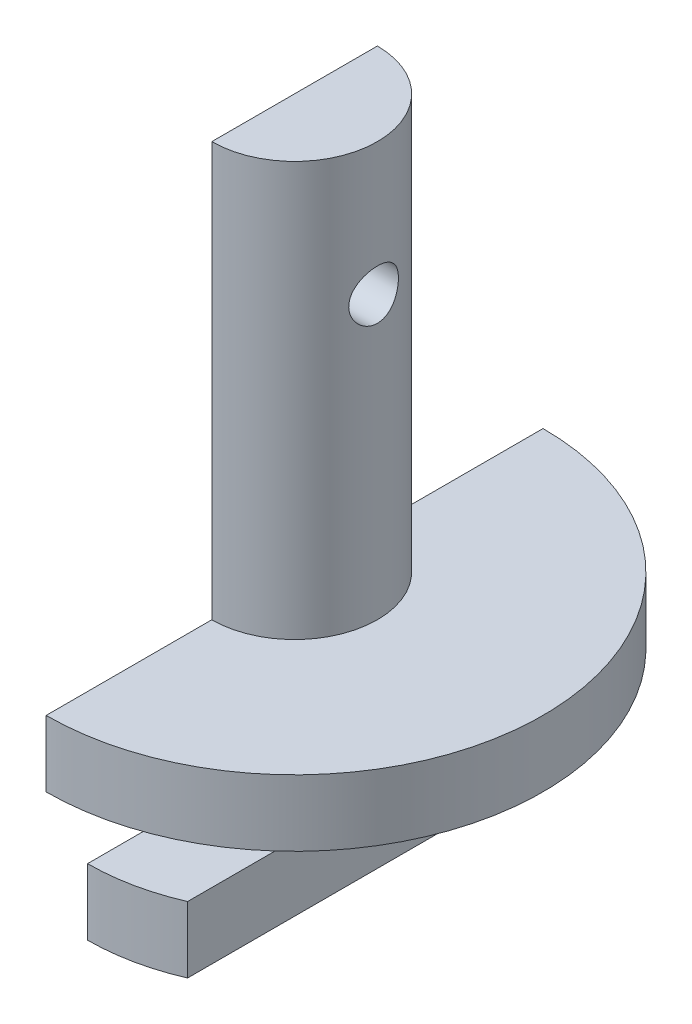
ISO-10303-21;
HEADER;
FILE_DESCRIPTION(('STEP AP214'),'2;1');
FILE_NAME('part.step','',(''),(''),'','','');
FILE_SCHEMA(('AUTOMOTIVE_DESIGN { 1 0 10303 214 1 1 1 1 }'));
ENDSEC;
DATA;
#1=APPLICATION_CONTEXT('core data for automotive mechanical design processes');
#2=APPLICATION_PROTOCOL_DEFINITION('international standard','automotive_design',2000,#1);
#3=PRODUCT_CONTEXT('',#1,'mechanical');
#4=PRODUCT('Part','Part','',(#3));
#5=PRODUCT_RELATED_PRODUCT_CATEGORY('part','',(#4));
#6=PRODUCT_DEFINITION_FORMATION('','',#4);
#7=PRODUCT_DEFINITION_CONTEXT('part definition',#1,'design');
#8=PRODUCT_DEFINITION('design','',#6,#7);
#9=PRODUCT_DEFINITION_SHAPE('','',#8);
#10=(LENGTH_UNIT() NAMED_UNIT(*) SI_UNIT(.MILLI.,.METRE.));
#11=(NAMED_UNIT(*) PLANE_ANGLE_UNIT() SI_UNIT($,.RADIAN.));
#12=(NAMED_UNIT(*) SI_UNIT($,.STERADIAN.) SOLID_ANGLE_UNIT());
#13=UNCERTAINTY_MEASURE_WITH_UNIT(LENGTH_MEASURE(1.E-05),#10,'distance_accuracy_value','');
#14=(GEOMETRIC_REPRESENTATION_CONTEXT(3) GLOBAL_UNCERTAINTY_ASSIGNED_CONTEXT((#13)) GLOBAL_UNIT_ASSIGNED_CONTEXT((#10,
#11,#12)) REPRESENTATION_CONTEXT('',''));
#15=CARTESIAN_POINT('',(0.,0.,0.));
#16=DIRECTION('',(0.,0.,1.));
#17=DIRECTION('',(1.,0.,0.));
#18=AXIS2_PLACEMENT_3D('',#15,#16,#17);
#19=CARTESIAN_POINT('',(0.,0.,0.));
#20=DIRECTION('',(0.,-1.,0.));
#21=DIRECTION('',(0.,0.,-1.));
#22=AXIS2_PLACEMENT_3D('',#19,#20,#21);
#23=CYLINDRICAL_SURFACE('',#22,12.5);
#24=DIRECTION('',(0.,-1.,0.));
#25=VECTOR('',#24,1.);
#26=CARTESIAN_POINT('',(0.,0.,12.5));
#27=LINE('',#26,#25);
#28=CARTESIAN_POINT('',(0.,0.,12.5));
#29=VERTEX_POINT('',#28);
#30=CARTESIAN_POINT('',(0.,4.,12.5));
#31=VERTEX_POINT('',#30);
#32=EDGE_CURVE('E240',#29,#31,#27,.F.);
#33=ORIENTED_EDGE('',*,*,#32,.F.);
#34=CARTESIAN_POINT('',(0.,0.,0.));
#35=DIRECTION('',(0.,-1.,0.));
#36=DIRECTION('',(0.,0.,-1.));
#37=AXIS2_PLACEMENT_3D('',#34,#35,#36);
#38=CIRCLE('',#37,12.5);
#39=CARTESIAN_POINT('',(5.,0.,11.4564392373896));
#40=VERTEX_POINT('',#39);
#41=EDGE_CURVE('E11',#40,#29,#38,.T.);
#42=ORIENTED_EDGE('',*,*,#41,.F.);
#43=DIRECTION('',(0.,-1.,0.));
#44=VECTOR('',#43,1.);
#45=CARTESIAN_POINT('',(5.,0.,11.4564392373896));
#46=LINE('',#45,#44);
#47=CARTESIAN_POINT('',(5.,4.,11.4564392373896));
#48=VERTEX_POINT('',#47);
#49=EDGE_CURVE('E224',#48,#40,#46,.T.);
#50=ORIENTED_EDGE('',*,*,#49,.F.);
#51=CARTESIAN_POINT('',(0.,4.,0.));
#52=DIRECTION('',(0.,-1.,0.));
#53=DIRECTION('',(0.,0.,-1.));
#54=AXIS2_PLACEMENT_3D('',#51,#52,#53);
#55=CIRCLE('',#54,12.5);
#56=EDGE_CURVE('E156',#48,#31,#55,.T.);
#57=ORIENTED_EDGE('',*,*,#56,.T.);
#58=EDGE_LOOP('',(#33,#42,#50,#57));
#59=FACE_BOUND('',#58,.T.);
#60=ADVANCED_FACE('F33',(#59),#23,.T.);
#61=CARTESIAN_POINT('',(12.5,4.,0.));
#62=DIRECTION('',(0.,1.,0.));
#63=DIRECTION('',(0.,0.,1.));
#64=AXIS2_PLACEMENT_3D('',#61,#62,#63);
#65=PLANE('',#64);
#66=DIRECTION('',(0.,0.,-1.));
#67=VECTOR('',#66,1.);
#68=CARTESIAN_POINT('',(0.,4.,0.));
#69=LINE('',#68,#67);
#70=CARTESIAN_POINT('',(0.,4.,7.5));
#71=VERTEX_POINT('',#70);
#72=EDGE_CURVE('E239',#31,#71,#69,.T.);
#73=ORIENTED_EDGE('',*,*,#72,.F.);
#74=ORIENTED_EDGE('',*,*,#56,.F.);
#75=DIRECTION('',(0.,0.,1.));
#76=VECTOR('',#75,1.);
#77=CARTESIAN_POINT('',(5.,4.,-15.));
#78=LINE('',#77,#76);
#79=CARTESIAN_POINT('',(5.,4.,5.59016994374948));
#80=VERTEX_POINT('',#79);
#81=EDGE_CURVE('E164',#80,#48,#78,.T.);
#82=ORIENTED_EDGE('',*,*,#81,.F.);
#83=CARTESIAN_POINT('',(0.,4.,0.));
#84=DIRECTION('',(0.,-1.,0.));
#85=DIRECTION('',(0.,0.,-1.));
#86=AXIS2_PLACEMENT_3D('',#83,#84,#85);
#87=CIRCLE('',#86,7.5);
#88=EDGE_CURVE('E155',#80,#71,#87,.T.);
#89=ORIENTED_EDGE('',*,*,#88,.T.);
#90=EDGE_LOOP('',(#73,#74,#82,#89));
#91=FACE_BOUND('',#90,.T.);
#92=ADVANCED_FACE('F192',(#91),#65,.T.);
#93=CARTESIAN_POINT('',(0.,0.,0.));
#94=DIRECTION('',(0.,-1.,0.));
#95=DIRECTION('',(0.,0.,-1.));
#96=AXIS2_PLACEMENT_3D('',#93,#94,#95);
#97=CYLINDRICAL_SURFACE('',#96,15.);
#98=CARTESIAN_POINT('',(0.,9.,0.));
#99=DIRECTION('',(0.,-1.,0.));
#100=DIRECTION('',(0.,0.,-1.));
#101=AXIS2_PLACEMENT_3D('',#98,#99,#100);
#102=CIRCLE('',#101,15.);
#103=CARTESIAN_POINT('',(0.,9.,-15.));
#104=VERTEX_POINT('',#103);
#105=CARTESIAN_POINT('',(0.,9.,15.));
#106=VERTEX_POINT('',#105);
#107=EDGE_CURVE('E138',#104,#106,#102,.T.);
#108=ORIENTED_EDGE('',*,*,#107,.F.);
#109=DIRECTION('',(0.,1.,0.));
#110=VECTOR('',#109,1.);
#111=CARTESIAN_POINT('',(0.,-5.62511796928788,-15.));
#112=LINE('',#111,#110);
#113=CARTESIAN_POINT('',(0.,13.,-15.));
#114=VERTEX_POINT('',#113);
#115=EDGE_CURVE('E141',#104,#114,#112,.T.);
#116=ORIENTED_EDGE('',*,*,#115,.T.);
#117=CARTESIAN_POINT('',(0.,13.,0.));
#118=DIRECTION('',(0.,-1.,0.));
#119=DIRECTION('',(0.,0.,-1.));
#120=AXIS2_PLACEMENT_3D('',#117,#118,#119);
#121=CIRCLE('',#120,15.);
#122=CARTESIAN_POINT('',(0.,13.,15.));
#123=VERTEX_POINT('',#122);
#124=EDGE_CURVE('E140',#114,#123,#121,.T.);
#125=ORIENTED_EDGE('',*,*,#124,.T.);
#126=DIRECTION('',(0.,1.,0.));
#127=VECTOR('',#126,1.);
#128=CARTESIAN_POINT('',(0.,-5.62511796928788,15.));
#129=LINE('',#128,#127);
#130=EDGE_CURVE('E122',#106,#123,#129,.T.);
#131=ORIENTED_EDGE('',*,*,#130,.F.);
#132=EDGE_LOOP('',(#108,#116,#125,#131));
#133=FACE_BOUND('',#132,.T.);
#134=ADVANCED_FACE('F136',(#133),#97,.T.);
#135=CARTESIAN_POINT('',(0.,0.,0.));
#136=DIRECTION('',(0.,-1.,0.));
#137=DIRECTION('',(0.,0.,-1.));
#138=AXIS2_PLACEMENT_3D('',#135,#136,#137);
#139=PLANE('',#138);
#140=DIRECTION('',(0.,0.,1.));
#141=VECTOR('',#140,1.);
#142=CARTESIAN_POINT('',(0.,0.,0.));
#143=LINE('',#142,#141);
#144=CARTESIAN_POINT('',(0.,0.,-12.5));
#145=VERTEX_POINT('',#144);
#146=EDGE_CURVE('E219',#145,#29,#143,.T.);
#147=ORIENTED_EDGE('',*,*,#146,.F.);
#148=CARTESIAN_POINT('',(5.,0.,-11.4564392373896));
#149=VERTEX_POINT('',#148);
#150=EDGE_CURVE('E42',#145,#149,#38,.T.);
#151=ORIENTED_EDGE('',*,*,#150,.T.);
#152=DIRECTION('',(0.,0.,-1.));
#153=VECTOR('',#152,1.);
#154=CARTESIAN_POINT('',(5.,0.,0.));
#155=LINE('',#154,#153);
#156=EDGE_CURVE('E227',#40,#149,#155,.T.);
#157=ORIENTED_EDGE('',*,*,#156,.F.);
#158=ORIENTED_EDGE('',*,*,#41,.T.);
#159=EDGE_LOOP('',(#147,#151,#157,#158));
#160=FACE_BOUND('',#159,.T.);
#161=ADVANCED_FACE('F35',(#160),#139,.T.);
#162=DIRECTION('',(0.,-1.,0.));
#163=VECTOR('',#162,1.);
#164=CARTESIAN_POINT('',(0.,0.,-12.5));
#165=LINE('',#164,#163);
#166=CARTESIAN_POINT('',(0.,4.,-12.5));
#167=VERTEX_POINT('',#166);
#168=EDGE_CURVE('E213',#167,#145,#165,.T.);
#169=ORIENTED_EDGE('',*,*,#168,.F.);
#170=CARTESIAN_POINT('',(5.,4.,-11.4564392373896));
#171=VERTEX_POINT('',#170);
#172=EDGE_CURVE('E154',#167,#171,#55,.T.);
#173=ORIENTED_EDGE('',*,*,#172,.T.);
#174=DIRECTION('',(0.,-1.,0.));
#175=VECTOR('',#174,1.);
#176=CARTESIAN_POINT('',(5.,0.,-11.4564392373896));
#177=LINE('',#176,#175);
#178=EDGE_CURVE('E247',#149,#171,#177,.F.);
#179=ORIENTED_EDGE('',*,*,#178,.F.);
#180=ORIENTED_EDGE('',*,*,#150,.F.);
#181=EDGE_LOOP('',(#169,#173,#179,#180));
#182=FACE_BOUND('',#181,.T.);
#183=ADVANCED_FACE('F194',(#182),#23,.T.);
#184=CARTESIAN_POINT('',(0.,4.,-7.5));
#185=VERTEX_POINT('',#184);
#186=EDGE_CURVE('E218',#185,#167,#69,.T.);
#187=ORIENTED_EDGE('',*,*,#186,.F.);
#188=CARTESIAN_POINT('',(5.,4.,-5.59016994374948));
#189=VERTEX_POINT('',#188);
#190=EDGE_CURVE('E58',#185,#189,#87,.T.);
#191=ORIENTED_EDGE('',*,*,#190,.T.);
#192=EDGE_CURVE('E221',#171,#189,#78,.T.);
#193=ORIENTED_EDGE('',*,*,#192,.F.);
#194=ORIENTED_EDGE('',*,*,#172,.F.);
#195=EDGE_LOOP('',(#187,#191,#193,#194));
#196=FACE_BOUND('',#195,.T.);
#197=ADVANCED_FACE('F201',(#196),#65,.T.);
#198=CARTESIAN_POINT('',(0.,0.,0.));
#199=DIRECTION('',(0.,-1.,0.));
#200=DIRECTION('',(0.,0.,-1.));
#201=AXIS2_PLACEMENT_3D('',#198,#199,#200);
#202=CYLINDRICAL_SURFACE('',#201,7.5);
#203=DIRECTION('',(0.,-1.,0.));
#204=VECTOR('',#203,1.);
#205=CARTESIAN_POINT('',(0.,0.,7.5));
#206=LINE('',#205,#204);
#207=CARTESIAN_POINT('',(0.,9.,7.5));
#208=VERTEX_POINT('',#207);
#209=EDGE_CURVE('E125',#71,#208,#206,.F.);
#210=ORIENTED_EDGE('',*,*,#209,.F.);
#211=ORIENTED_EDGE('',*,*,#88,.F.);
#212=EDGE_CURVE('E152',#189,#80,#87,.T.);
#213=ORIENTED_EDGE('',*,*,#212,.F.);
#214=ORIENTED_EDGE('',*,*,#190,.F.);
#215=DIRECTION('',(0.,-1.,0.));
#216=VECTOR('',#215,1.);
#217=CARTESIAN_POINT('',(0.,0.,-7.5));
#218=LINE('',#217,#216);
#219=CARTESIAN_POINT('',(0.,9.,-7.5));
#220=VERTEX_POINT('',#219);
#221=EDGE_CURVE('E244',#220,#185,#218,.T.);
#222=ORIENTED_EDGE('',*,*,#221,.F.);
#223=CARTESIAN_POINT('',(0.,9.,0.));
#224=DIRECTION('',(0.,-1.,0.));
#225=DIRECTION('',(0.,0.,-1.));
#226=AXIS2_PLACEMENT_3D('',#223,#224,#225);
#227=CIRCLE('',#226,7.5);
#228=EDGE_CURVE('E145',#220,#208,#227,.T.);
#229=ORIENTED_EDGE('',*,*,#228,.T.);
#230=EDGE_LOOP('',(#210,#211,#213,#214,#222,#229));
#231=FACE_BOUND('',#230,.T.);
#232=ADVANCED_FACE('F209',(#231),#202,.T.);
#233=CARTESIAN_POINT('',(7.5,9.,0.));
#234=DIRECTION('',(0.,-1.,0.));
#235=DIRECTION('',(0.,0.,-1.));
#236=AXIS2_PLACEMENT_3D('',#233,#234,#235);
#237=PLANE('',#236);
#238=DIRECTION('',(0.,0.,1.));
#239=VECTOR('',#238,1.);
#240=CARTESIAN_POINT('',(0.,9.,0.));
#241=LINE('',#240,#239);
#242=EDGE_CURVE('E132',#104,#220,#241,.T.);
#243=ORIENTED_EDGE('',*,*,#242,.F.);
#244=ORIENTED_EDGE('',*,*,#107,.T.);
#245=EDGE_CURVE('E118',#208,#106,#241,.T.);
#246=ORIENTED_EDGE('',*,*,#245,.F.);
#247=ORIENTED_EDGE('',*,*,#228,.F.);
#248=EDGE_LOOP('',(#243,#244,#246,#247));
#249=FACE_BOUND('',#248,.T.);
#250=ADVANCED_FACE('F144',(#249),#237,.T.);
#251=CARTESIAN_POINT('',(15.,13.,0.));
#252=DIRECTION('',(0.,1.,0.));
#253=DIRECTION('',(0.,0.,1.));
#254=AXIS2_PLACEMENT_3D('',#251,#252,#253);
#255=PLANE('',#254);
#256=DIRECTION('',(0.,0.,-1.));
#257=VECTOR('',#256,1.);
#258=CARTESIAN_POINT('',(0.,13.,0.));
#259=LINE('',#258,#257);
#260=CARTESIAN_POINT('',(0.,13.,5.));
#261=VERTEX_POINT('',#260);
#262=EDGE_CURVE('E130',#123,#261,#259,.T.);
#263=ORIENTED_EDGE('',*,*,#262,.F.);
#264=ORIENTED_EDGE('',*,*,#124,.F.);
#265=CARTESIAN_POINT('',(0.,13.,-5.));
#266=VERTEX_POINT('',#265);
#267=EDGE_CURVE('E257',#266,#114,#259,.T.);
#268=ORIENTED_EDGE('',*,*,#267,.F.);
#269=CARTESIAN_POINT('',(0.,13.,0.));
#270=DIRECTION('',(0.,-1.,0.));
#271=DIRECTION('',(0.,0.,-1.));
#272=AXIS2_PLACEMENT_3D('',#269,#270,#271);
#273=CIRCLE('',#272,5.);
#274=EDGE_CURVE('E148',#266,#261,#273,.T.);
#275=ORIENTED_EDGE('',*,*,#274,.T.);
#276=EDGE_LOOP('',(#263,#264,#268,#275));
#277=FACE_BOUND('',#276,.T.);
#278=ADVANCED_FACE('F189',(#277),#255,.T.);
#279=CARTESIAN_POINT('',(0.,0.,0.));
#280=DIRECTION('',(0.,-1.,0.));
#281=DIRECTION('',(0.,0.,-1.));
#282=AXIS2_PLACEMENT_3D('',#279,#280,#281);
#283=CYLINDRICAL_SURFACE('',#282,5.);
#284=DIRECTION('',(0.,-1.,0.));
#285=VECTOR('',#284,1.);
#286=CARTESIAN_POINT('',(0.,0.,5.));
#287=LINE('',#286,#285);
#288=CARTESIAN_POINT('',(0.,38.,5.));
#289=VERTEX_POINT('',#288);
#290=EDGE_CURVE('E50',#261,#289,#287,.F.);
#291=ORIENTED_EDGE('',*,*,#290,.F.);
#292=ORIENTED_EDGE('',*,*,#274,.F.);
#293=DIRECTION('',(0.,-1.,0.));
#294=VECTOR('',#293,1.);
#295=CARTESIAN_POINT('',(0.,0.,-5.));
#296=LINE('',#295,#294);
#297=CARTESIAN_POINT('',(0.,38.,-5.));
#298=VERTEX_POINT('',#297);
#299=EDGE_CURVE('E260',#298,#266,#296,.T.);
#300=ORIENTED_EDGE('',*,*,#299,.F.);
#301=CARTESIAN_POINT('',(0.,38.,0.));
#302=DIRECTION('',(0.,-1.,0.));
#303=DIRECTION('',(0.,0.,-1.));
#304=AXIS2_PLACEMENT_3D('',#301,#302,#303);
#305=CIRCLE('',#304,5.);
#306=EDGE_CURVE('E249',#298,#289,#305,.T.);
#307=ORIENTED_EDGE('',*,*,#306,.T.);
#308=EDGE_LOOP('',(#291,#292,#300,#307));
#309=FACE_BOUND('',#308,.T.);
#310=CARTESIAN_POINT('',(4.76969600708473,30.,-1.5));
#311=CARTESIAN_POINT('',(4.7696968572698,30.0821945479424,-1.49999897633764));
#312=CARTESIAN_POINT('',(4.77184390209069,30.164399224144,-1.49322108167142));
#313=CARTESIAN_POINT('',(4.780165783029,30.3264052495919,-1.46635844446749));
#314=CARTESIAN_POINT('',(4.78634196493468,30.4062057865015,-1.44626925573578));
#315=CARTESIAN_POINT('',(4.80196102485633,30.5610347282717,-1.39352753269955));
#316=CARTESIAN_POINT('',(4.81139846703232,30.6360708296331,-1.36089589394244));
#317=CARTESIAN_POINT('',(4.83246932547567,30.7796219339953,-1.28406421917929));
#318=CARTESIAN_POINT('',(4.8441030704102,30.8481359586844,-1.23986245137053));
#319=CARTESIAN_POINT('',(4.86866862185766,30.9788663905774,-1.13964754141627));
#320=CARTESIAN_POINT('',(4.88162808311636,31.0408458979463,-1.08333207175807));
#321=CARTESIAN_POINT('',(4.90714861936757,31.1546379513225,-0.9611362375796));
#322=CARTESIAN_POINT('',(4.91970964297705,31.2064491904499,-0.895254645461113));
#323=CARTESIAN_POINT('',(4.94333214579389,31.2994626998333,-0.754111437793691));
#324=CARTESIAN_POINT('',(4.95435724342404,31.3404234244428,-0.678684021335815));
#325=CARTESIAN_POINT('',(4.97334435920684,31.4089872590428,-0.521624645369353));
#326=CARTESIAN_POINT('',(4.98130703789496,31.4365932498575,-0.43999402838791));
#327=CARTESIAN_POINT('',(4.9930764600359,31.4768800010905,-0.275323852630828));
#328=CARTESIAN_POINT('',(4.99699557369339,31.4899651276527,-0.1923913989538));
#329=CARTESIAN_POINT('',(5.00063201501348,31.5021173246464,-0.0254218237493145));
#330=CARTESIAN_POINT('',(5.00035022521079,31.501187339402,0.0586150620503683));
#331=CARTESIAN_POINT('',(4.99569603817659,31.485607131457,0.22257115660016));
#332=CARTESIAN_POINT('',(4.9914542020526,31.4713948061901,0.302536267641342));
#333=CARTESIAN_POINT('',(4.97951522112593,31.4303686640057,0.458889213442527));
#334=CARTESIAN_POINT('',(4.97181785750586,31.4035540490573,0.535276821322846));
#335=CARTESIAN_POINT('',(4.95365220986963,31.3377879765814,0.683347326351281));
#336=CARTESIAN_POINT('',(4.94315269676706,31.2986987971927,0.754965064694479));
#337=CARTESIAN_POINT('',(4.92049640648069,31.2096021475718,0.890764673783157));
#338=CARTESIAN_POINT('',(4.90833923637778,31.1595920870365,0.954944774872131));
#339=CARTESIAN_POINT('',(4.88311550488166,31.0478022492484,1.0766604815298));
#340=CARTESIAN_POINT('',(4.87003195321461,30.9856430809703,1.13384458040112));
#341=CARTESIAN_POINT('',(4.84483979887497,30.8524899821099,1.23707651539824));
#342=CARTESIAN_POINT('',(4.8327312931702,30.7814951746108,1.28312324482853));
#343=CARTESIAN_POINT('',(4.81077903197678,30.631760530751,1.3631399533545));
#344=CARTESIAN_POINT('',(4.80095810695957,30.5529529541371,1.39698989237679));
#345=CARTESIAN_POINT('',(4.78496392548436,30.3903927915545,1.45083362878413));
#346=CARTESIAN_POINT('',(4.7787894791583,30.3066418284654,1.4708319464056));
#347=CARTESIAN_POINT('',(4.77104849541241,30.1399176392607,1.49574770282165));
#348=CARTESIAN_POINT('',(4.76931878670441,30.057031776106,1.50119946380212));
#349=CARTESIAN_POINT('',(4.77021192441924,29.8915270999901,1.49835947233062));
#350=CARTESIAN_POINT('',(4.77283416156589,29.8089082512691,1.4900696437133));
#351=CARTESIAN_POINT('',(4.78197558554912,29.6485116220291,1.4604576357419));
#352=CARTESIAN_POINT('',(4.78839176507489,29.5706638357365,1.4394796143128));
#353=CARTESIAN_POINT('',(4.80429141231227,29.4195983091851,1.3854857774794));
#354=CARTESIAN_POINT('',(4.81377535359073,29.3463812858594,1.35246810342759));
#355=CARTESIAN_POINT('',(4.83505835023047,29.2044825359279,1.274318711965));
#356=CARTESIAN_POINT('',(4.84691271069799,29.1359752790142,1.22888564172729));
#357=CARTESIAN_POINT('',(4.87148205646987,29.0073618938192,1.12755301600385));
#358=CARTESIAN_POINT('',(4.88419724730003,28.9472577823872,1.07165095534897));
#359=CARTESIAN_POINT('',(4.90963633548158,28.8348195941853,0.948455132493598));
#360=CARTESIAN_POINT('',(4.92234245063004,28.782864371013,0.880811065857434));
#361=CARTESIAN_POINT('',(4.94584851748651,28.6910332989722,0.737461784590248));
#362=CARTESIAN_POINT('',(4.95664856384717,28.6511568502185,0.661756970543942));
#363=CARTESIAN_POINT('',(4.97505970474957,28.5849999694317,0.504935504705219));
#364=CARTESIAN_POINT('',(4.98269453424966,28.558617983841,0.423864622037837));
#365=CARTESIAN_POINT('',(4.99401979596827,28.5199390811096,0.258169966504587));
#366=CARTESIAN_POINT('',(4.9977113567088,28.5076381340516,0.173547217354761));
#367=CARTESIAN_POINT('',(5.00066544081399,28.4977769559455,0.00665215388274155));
#368=CARTESIAN_POINT('',(5.00009305111322,28.4996673045922,-0.0755851790862078));
#369=CARTESIAN_POINT('',(4.99497264465037,28.5168216324991,-0.238519481164405));
#370=CARTESIAN_POINT('',(4.99042485330463,28.5320848534804,-0.31921653734653));
#371=CARTESIAN_POINT('',(4.97791168358327,28.5752116613996,-0.475935813041359));
#372=CARTESIAN_POINT('',(4.96998352900866,28.602938180649,-0.551998927351393));
#373=CARTESIAN_POINT('',(4.9515294303945,28.6700819145072,-0.698433237752054));
#374=CARTESIAN_POINT('',(4.94100305949946,28.7095010502862,-0.768803496050581));
#375=CARTESIAN_POINT('',(4.91803965828228,28.80037345743,-0.904301892420565));
#376=CARTESIAN_POINT('',(4.90555226923559,28.8521714300008,-0.969190250076769));
#377=CARTESIAN_POINT('',(4.88023537212334,28.9657103883328,-1.08953757134595));
#378=CARTESIAN_POINT('',(4.86740576641079,29.0274542378982,-1.14499380960194));
#379=CARTESIAN_POINT('',(4.84240680631319,29.1613407783105,-1.24656269394549));
#380=CARTESIAN_POINT('',(4.83026852693485,29.2337385533904,-1.29234759757956));
#381=CARTESIAN_POINT('',(4.80852547508793,29.385555174161,-1.37104313528776));
#382=CARTESIAN_POINT('',(4.79891948596956,29.4649706236012,-1.40395995557289));
#383=CARTESIAN_POINT('',(4.78427816717595,29.6197404316063,-1.4530194253295));
#384=CARTESIAN_POINT('',(4.7788615484052,29.694608646931,-1.47058859011232));
#385=CARTESIAN_POINT('',(4.77157042597167,29.8463152224958,-1.49407818835144));
#386=CARTESIAN_POINT('',(4.76969521221431,29.9231531846452,-1.50000095706095));
#387=CARTESIAN_POINT('',(4.76969600708473,30.,-1.5));
#388=B_SPLINE_CURVE_WITH_KNOTS('',3,(#310,#311,#312,#313,#314,#315,#316,#317,#318,#319,#320,
#321,#322,#323,#324,#325,#326,#327,#328,#329,#330,#331,#332,#333,#334,#335,#336,#337,#338,#339,
#340,#341,#342,#343,#344,#345,#346,#347,#348,#349,#350,#351,#352,#353,#354,#355,#356,#357,#358,
#359,#360,#361,#362,#363,#364,#365,#366,#367,#368,#369,#370,#371,#372,#373,#374,#375,#376,#377,
#378,#379,#380,#381,#382,#383,#384,#385,#386,#387),.UNSPECIFIED.,.T.,.F.,(4,2,2,2,2,2,2,2,2,2,2,
2,2,2,2,2,2,2,2,2,2,2,2,2,2,2,2,2,2,2,2,2,2,2,2,2,2,2,4),(0.,0.246300165915545,
0.492682641689001,0.738656414466192,0.984667025370103,1.23773150007984,1.49082847871273,
1.74915939273645,2.00743455587877,2.25832140149558,2.5091555410144,2.7520012599088,
2.99486235890376,3.24055209335676,3.48630016590831,3.74152147023278,3.99676812491863,
4.25446238246266,4.51207250628412,4.7600808079031,5.00805439107388,5.24958594938817,
5.49115481045788,5.73920731809389,5.98731925928923,6.24479506100603,6.50225807324203,
6.75775391814326,7.01317662321683,7.25876303911221,7.50433553047755,7.7472709687222,
7.99024634491379,8.24099627054489,8.49181852629891,8.75011639669148,9.00828993963945,
9.23861153857448,9.46888695033561),.UNSPECIFIED.);
#389=CARTESIAN_POINT('',(4.76969600708473,30.,-1.5));
#390=VERTEX_POINT('',#389);
#391=EDGE_CURVE('E158',#390,#390,#388,.T.);
#392=ORIENTED_EDGE('',*,*,#391,.F.);
#393=EDGE_LOOP('',(#392));
#394=FACE_BOUND('',#393,.T.);
#395=ADVANCED_FACE('F165',(#309,#394),#283,.T.);
#396=CARTESIAN_POINT('',(5.,38.,0.));
#397=DIRECTION('',(0.,1.,0.));
#398=DIRECTION('',(0.,0.,1.));
#399=AXIS2_PLACEMENT_3D('',#396,#397,#398);
#400=PLANE('',#399);
#401=DIRECTION('',(0.,0.,-1.));
#402=VECTOR('',#401,1.);
#403=CARTESIAN_POINT('',(0.,38.,0.));
#404=LINE('',#403,#402);
#405=EDGE_CURVE('E264',#289,#298,#404,.T.);
#406=ORIENTED_EDGE('',*,*,#405,.F.);
#407=ORIENTED_EDGE('',*,*,#306,.F.);
#408=EDGE_LOOP('',(#406,#407));
#409=FACE_BOUND('',#408,.T.);
#410=ADVANCED_FACE('F179',(#409),#400,.T.);
#411=CARTESIAN_POINT('',(5.,4.,-15.));
#412=DIRECTION('',(-1.,0.,0.));
#413=DIRECTION('',(0.,-1.,0.));
#414=AXIS2_PLACEMENT_3D('',#411,#412,#413);
#415=PLANE('',#414);
#416=ORIENTED_EDGE('',*,*,#178,.T.);
#417=ORIENTED_EDGE('',*,*,#192,.T.);
#418=EDGE_CURVE('E225',#189,#80,#78,.T.);
#419=ORIENTED_EDGE('',*,*,#418,.T.);
#420=ORIENTED_EDGE('',*,*,#81,.T.);
#421=ORIENTED_EDGE('',*,*,#49,.T.);
#422=ORIENTED_EDGE('',*,*,#156,.T.);
#423=EDGE_LOOP('',(#416,#417,#419,#420,#421,#422));
#424=FACE_BOUND('',#423,.T.);
#425=ADVANCED_FACE('F176',(#424),#415,.F.);
#426=CARTESIAN_POINT('',(26.6660121846527,4.,-15.));
#427=DIRECTION('',(0.,1.,0.));
#428=DIRECTION('',(-1.,0.,0.));
#429=AXIS2_PLACEMENT_3D('',#426,#427,#428);
#430=PLANE('',#429);
#431=ORIENTED_EDGE('',*,*,#212,.T.);
#432=ORIENTED_EDGE('',*,*,#418,.F.);
#433=EDGE_LOOP('',(#431,#432));
#434=FACE_BOUND('',#433,.T.);
#435=ADVANCED_FACE('F174',(#434),#430,.F.);
#436=CARTESIAN_POINT('',(-15.,30.,0.));
#437=DIRECTION('',(1.,0.,0.));
#438=DIRECTION('',(0.,0.,-1.));
#439=AXIS2_PLACEMENT_3D('',#436,#437,#438);
#440=CYLINDRICAL_SURFACE('',#439,1.5);
#441=CARTESIAN_POINT('',(0.,30.,0.));
#442=DIRECTION('',(1.,0.,0.));
#443=DIRECTION('',(0.,0.,-1.));
#444=AXIS2_PLACEMENT_3D('',#441,#442,#443);
#445=CIRCLE('',#444,1.5);
#446=CARTESIAN_POINT('',(0.,30.,-1.5));
#447=VERTEX_POINT('',#446);
#448=EDGE_CURVE('E37',#447,#447,#445,.F.);
#449=ORIENTED_EDGE('',*,*,#448,.T.);
#450=EDGE_LOOP('',(#449));
#451=FACE_BOUND('',#450,.T.);
#452=ORIENTED_EDGE('',*,*,#391,.T.);
#453=EDGE_LOOP('',(#452));
#454=FACE_BOUND('',#453,.T.);
#455=ADVANCED_FACE('F169',(#451,#454),#440,.F.);
#456=CARTESIAN_POINT('',(0.,-5.62511796928788,-15.));
#457=DIRECTION('',(1.,0.,0.));
#458=DIRECTION('',(0.,0.,-1.));
#459=AXIS2_PLACEMENT_3D('',#456,#457,#458);
#460=PLANE('',#459);
#461=ORIENTED_EDGE('',*,*,#242,.T.);
#462=ORIENTED_EDGE('',*,*,#221,.T.);
#463=ORIENTED_EDGE('',*,*,#186,.T.);
#464=ORIENTED_EDGE('',*,*,#168,.T.);
#465=ORIENTED_EDGE('',*,*,#146,.T.);
#466=ORIENTED_EDGE('',*,*,#32,.T.);
#467=ORIENTED_EDGE('',*,*,#72,.T.);
#468=ORIENTED_EDGE('',*,*,#209,.T.);
#469=ORIENTED_EDGE('',*,*,#245,.T.);
#470=ORIENTED_EDGE('',*,*,#130,.T.);
#471=ORIENTED_EDGE('',*,*,#262,.T.);
#472=ORIENTED_EDGE('',*,*,#290,.T.);
#473=ORIENTED_EDGE('',*,*,#405,.T.);
#474=ORIENTED_EDGE('',*,*,#299,.T.);
#475=ORIENTED_EDGE('',*,*,#267,.T.);
#476=ORIENTED_EDGE('',*,*,#115,.F.);
#477=EDGE_LOOP('',(#461,#462,#463,#464,#465,#466,#467,#468,#469,#470,#471,#472,#473,#474,#475,#476));
#478=FACE_BOUND('',#477,.T.);
#479=ORIENTED_EDGE('',*,*,#448,.F.);
#480=EDGE_LOOP('',(#479));
#481=FACE_BOUND('',#480,.T.);
#482=ADVANCED_FACE('F120',(#478,#481),#460,.F.);
#483=CLOSED_SHELL('',(#60,#92,#134,#161,#183,#197,#232,#250,#278,#395,#410,#425,#435,#455,#482));
#484=MANIFOLD_SOLID_BREP('B2',#483);
#485=ADVANCED_BREP_SHAPE_REPRESENTATION('',(#18,#484),#14);
#486=SHAPE_DEFINITION_REPRESENTATION(#9,#485);
ENDSEC;
END-ISO-10303-21;
